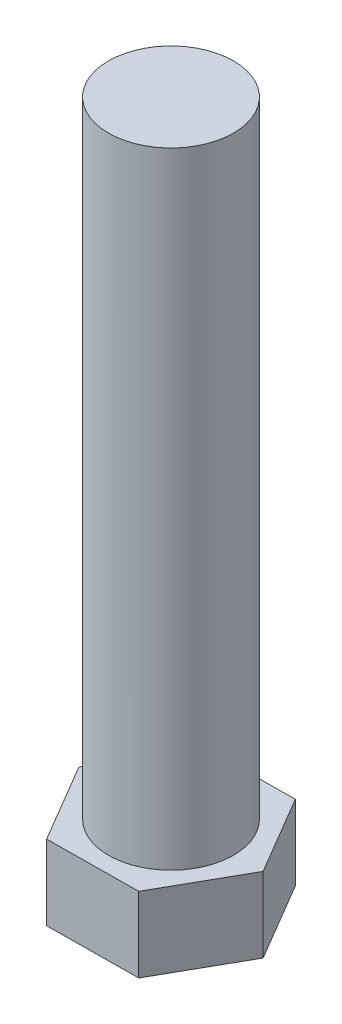
ISO-10303-21;
HEADER;
FILE_DESCRIPTION(('STEP AP214'),'2;1');
FILE_NAME('part.step','',(''),(''),'','','');
FILE_SCHEMA(('AUTOMOTIVE_DESIGN { 1 0 10303 214 1 1 1 1 }'));
ENDSEC;
DATA;
#1=APPLICATION_CONTEXT('core data for automotive mechanical design processes');
#2=APPLICATION_PROTOCOL_DEFINITION('international standard','automotive_design',2000,#1);
#3=PRODUCT_CONTEXT('',#1,'mechanical');
#4=PRODUCT('Part','Part','',(#3));
#5=PRODUCT_RELATED_PRODUCT_CATEGORY('part','',(#4));
#6=PRODUCT_DEFINITION_FORMATION('','',#4);
#7=PRODUCT_DEFINITION_CONTEXT('part definition',#1,'design');
#8=PRODUCT_DEFINITION('design','',#6,#7);
#9=PRODUCT_DEFINITION_SHAPE('','',#8);
#10=(LENGTH_UNIT() NAMED_UNIT(*) SI_UNIT(.MILLI.,.METRE.));
#11=(NAMED_UNIT(*) PLANE_ANGLE_UNIT() SI_UNIT($,.RADIAN.));
#12=(NAMED_UNIT(*) SI_UNIT($,.STERADIAN.) SOLID_ANGLE_UNIT());
#13=UNCERTAINTY_MEASURE_WITH_UNIT(LENGTH_MEASURE(1.E-05),#10,'distance_accuracy_value','');
#14=(GEOMETRIC_REPRESENTATION_CONTEXT(3) GLOBAL_UNCERTAINTY_ASSIGNED_CONTEXT((#13)) GLOBAL_UNIT_ASSIGNED_CONTEXT((#10,
#11,#12)) REPRESENTATION_CONTEXT('',''));
#15=CARTESIAN_POINT('',(0.,0.,0.));
#16=DIRECTION('',(0.,0.,1.));
#17=DIRECTION('',(1.,0.,0.));
#18=AXIS2_PLACEMENT_3D('',#15,#16,#17);
#19=CARTESIAN_POINT('',(0.,50.,0.));
#20=DIRECTION('',(0.,-1.,0.));
#21=DIRECTION('',(0.,0.,-1.));
#22=AXIS2_PLACEMENT_3D('',#19,#20,#21);
#23=CYLINDRICAL_SURFACE('',#22,5.);
#24=CARTESIAN_POINT('',(0.,50.,0.));
#25=DIRECTION('',(0.,1.,0.));
#26=DIRECTION('',(0.,0.,1.));
#27=AXIS2_PLACEMENT_3D('',#24,#25,#26);
#28=CIRCLE('',#27,5.);
#29=CARTESIAN_POINT('',(0.,50.,5.));
#30=VERTEX_POINT('',#29);
#31=EDGE_CURVE('E11',#30,#30,#28,.T.);
#32=ORIENTED_EDGE('',*,*,#31,.F.);
#33=EDGE_LOOP('',(#32));
#34=FACE_BOUND('',#33,.T.);
#35=CARTESIAN_POINT('',(0.,0.,0.));
#36=DIRECTION('',(0.,-1.,0.));
#37=DIRECTION('',(0.,0.,-1.));
#38=AXIS2_PLACEMENT_3D('',#35,#36,#37);
#39=CIRCLE('',#38,5.);
#40=CARTESIAN_POINT('',(0.,0.,-5.));
#41=VERTEX_POINT('',#40);
#42=EDGE_CURVE('E40',#41,#41,#39,.T.);
#43=ORIENTED_EDGE('',*,*,#42,.F.);
#44=EDGE_LOOP('',(#43));
#45=FACE_BOUND('',#44,.T.);
#46=ADVANCED_FACE('F32',(#34,#45),#23,.T.);
#47=CARTESIAN_POINT('',(0.,50.,0.));
#48=DIRECTION('',(0.,1.,0.));
#49=DIRECTION('',(0.,0.,1.));
#50=AXIS2_PLACEMENT_3D('',#47,#48,#49);
#51=PLANE('',#50);
#52=ORIENTED_EDGE('',*,*,#31,.T.);
#53=EDGE_LOOP('',(#52));
#54=FACE_BOUND('',#53,.T.);
#55=ADVANCED_FACE('F142',(#54),#51,.T.);
#56=CARTESIAN_POINT('',(7.29612582719991,-6.,-0.0671599350882289));
#57=DIRECTION('',(-0.87059096019763,0.,-0.492007499965364));
#58=DIRECTION('',(-0.492007499965364,0.,0.87059096019763));
#59=AXIS2_PLACEMENT_3D('',#56,#57,#58);
#60=PLANE('',#59);
#61=DIRECTION('',(-0.492007499965364,0.,0.87059096019763));
#62=VECTOR('',#61,1.);
#63=CARTESIAN_POINT('',(7.29612582719991,0.,-0.0671599350882289));
#64=LINE('',#63,#62);
#65=CARTESIAN_POINT('',(7.29612582719991,0.,-0.0671599350882289));
#66=VERTEX_POINT('',#65);
#67=CARTESIAN_POINT('',(3.70622512350288,0.,6.28505034801876));
#68=VERTEX_POINT('',#67);
#69=EDGE_CURVE('E117',#66,#68,#64,.T.);
#70=ORIENTED_EDGE('',*,*,#69,.T.);
#71=DIRECTION('',(0.,1.,0.));
#72=VECTOR('',#71,1.);
#73=CARTESIAN_POINT('',(3.70622512350288,-6.,6.28505034801876));
#74=LINE('',#73,#72);
#75=CARTESIAN_POINT('',(3.70622512350288,-6.,6.28505034801876));
#76=VERTEX_POINT('',#75);
#77=EDGE_CURVE('E134',#76,#68,#74,.T.);
#78=ORIENTED_EDGE('',*,*,#77,.F.);
#79=DIRECTION('',(-0.492007499965364,0.,0.87059096019763));
#80=VECTOR('',#79,1.);
#81=CARTESIAN_POINT('',(7.29612582719991,-6.,-0.0671599350882289));
#82=LINE('',#81,#80);
#83=CARTESIAN_POINT('',(7.29612582719991,-6.,-0.0671599350882289));
#84=VERTEX_POINT('',#83);
#85=EDGE_CURVE('E127',#84,#76,#82,.T.);
#86=ORIENTED_EDGE('',*,*,#85,.F.);
#87=DIRECTION('',(0.,1.,0.));
#88=VECTOR('',#87,1.);
#89=CARTESIAN_POINT('',(7.29612582719991,-6.,-0.0671599350882289));
#90=LINE('',#89,#88);
#91=EDGE_CURVE('E113',#84,#66,#90,.T.);
#92=ORIENTED_EDGE('',*,*,#91,.T.);
#93=EDGE_LOOP('',(#70,#78,#86,#92));
#94=FACE_BOUND('',#93,.T.);
#95=ADVANCED_FACE('F147',(#94),#60,.F.);
#96=CARTESIAN_POINT('',(3.70622512350288,-6.,6.28505034801876));
#97=DIRECTION('',(-0.00920448627633804,0.,-0.999957637818917));
#98=DIRECTION('',(-0.999957637818917,0.,0.00920448627633804));
#99=AXIS2_PLACEMENT_3D('',#96,#97,#98);
#100=PLANE('',#99);
#101=DIRECTION('',(-0.999957637818917,0.,0.00920448627633804));
#102=VECTOR('',#101,1.);
#103=CARTESIAN_POINT('',(3.70622512350288,0.,6.28505034801876));
#104=LINE('',#103,#102);
#105=CARTESIAN_POINT('',(-3.58990070369704,0.,6.35221028310699));
#106=VERTEX_POINT('',#105);
#107=EDGE_CURVE('E120',#68,#106,#104,.T.);
#108=ORIENTED_EDGE('',*,*,#107,.T.);
#109=DIRECTION('',(0.,1.,0.));
#110=VECTOR('',#109,1.);
#111=CARTESIAN_POINT('',(-3.58990070369704,-6.,6.35221028310699));
#112=LINE('',#111,#110);
#113=CARTESIAN_POINT('',(-3.58990070369704,-6.,6.35221028310699));
#114=VERTEX_POINT('',#113);
#115=EDGE_CURVE('E131',#114,#106,#112,.T.);
#116=ORIENTED_EDGE('',*,*,#115,.F.);
#117=DIRECTION('',(-0.999957637818917,0.,0.00920448627633804));
#118=VECTOR('',#117,1.);
#119=CARTESIAN_POINT('',(3.70622512350288,-6.,6.28505034801876));
#120=LINE('',#119,#118);
#121=EDGE_CURVE('E86',#76,#114,#120,.T.);
#122=ORIENTED_EDGE('',*,*,#121,.F.);
#123=ORIENTED_EDGE('',*,*,#77,.T.);
#124=EDGE_LOOP('',(#108,#116,#122,#123));
#125=FACE_BOUND('',#124,.T.);
#126=ADVANCED_FACE('F153',(#125),#100,.F.);
#127=CARTESIAN_POINT('',(-3.58990070369704,-6.,6.35221028310699));
#128=DIRECTION('',(0.861386473921292,0.,-0.507950137853552));
#129=DIRECTION('',(-0.507950137853552,0.,-0.861386473921292));
#130=AXIS2_PLACEMENT_3D('',#127,#128,#129);
#131=PLANE('',#130);
#132=DIRECTION('',(-0.507950137853552,0.,-0.861386473921292));
#133=VECTOR('',#132,1.);
#134=CARTESIAN_POINT('',(-3.58990070369704,0.,6.35221028310699));
#135=LINE('',#134,#133);
#136=CARTESIAN_POINT('',(-7.29612582719991,0.,0.0671599350882271));
#137=VERTEX_POINT('',#136);
#138=EDGE_CURVE('E122',#106,#137,#135,.T.);
#139=ORIENTED_EDGE('',*,*,#138,.T.);
#140=DIRECTION('',(0.,1.,0.));
#141=VECTOR('',#140,1.);
#142=CARTESIAN_POINT('',(-7.29612582719991,-6.,0.0671599350882271));
#143=LINE('',#142,#141);
#144=CARTESIAN_POINT('',(-7.29612582719991,-6.,0.0671599350882271));
#145=VERTEX_POINT('',#144);
#146=EDGE_CURVE('E108',#145,#137,#143,.T.);
#147=ORIENTED_EDGE('',*,*,#146,.F.);
#148=DIRECTION('',(-0.507950137853552,0.,-0.861386473921292));
#149=VECTOR('',#148,1.);
#150=CARTESIAN_POINT('',(-3.58990070369704,-6.,6.35221028310699));
#151=LINE('',#150,#149);
#152=EDGE_CURVE('E99',#114,#145,#151,.T.);
#153=ORIENTED_EDGE('',*,*,#152,.F.);
#154=ORIENTED_EDGE('',*,*,#115,.T.);
#155=EDGE_LOOP('',(#139,#147,#153,#154));
#156=FACE_BOUND('',#155,.T.);
#157=ADVANCED_FACE('F159',(#156),#131,.F.);
#158=CARTESIAN_POINT('',(-7.29612582719991,-6.,0.0671599350882271));
#159=DIRECTION('',(0.87059096019763,0.,0.492007499965365));
#160=DIRECTION('',(0.492007499965365,0.,-0.87059096019763));
#161=AXIS2_PLACEMENT_3D('',#158,#159,#160);
#162=PLANE('',#161);
#163=DIRECTION('',(0.492007499965365,0.,-0.87059096019763));
#164=VECTOR('',#163,1.);
#165=CARTESIAN_POINT('',(-7.29612582719991,0.,0.0671599350882271));
#166=LINE('',#165,#164);
#167=CARTESIAN_POINT('',(-3.70622512350287,0.,-6.28505034801877));
#168=VERTEX_POINT('',#167);
#169=EDGE_CURVE('E107',#137,#168,#166,.T.);
#170=ORIENTED_EDGE('',*,*,#169,.T.);
#171=DIRECTION('',(0.,1.,0.));
#172=VECTOR('',#171,1.);
#173=CARTESIAN_POINT('',(-3.70622512350287,-6.,-6.28505034801877));
#174=LINE('',#173,#172);
#175=CARTESIAN_POINT('',(-3.70622512350287,-6.,-6.28505034801877));
#176=VERTEX_POINT('',#175);
#177=EDGE_CURVE('E104',#176,#168,#174,.T.);
#178=ORIENTED_EDGE('',*,*,#177,.F.);
#179=DIRECTION('',(0.492007499965365,0.,-0.87059096019763));
#180=VECTOR('',#179,1.);
#181=CARTESIAN_POINT('',(-7.29612582719991,-6.,0.0671599350882271));
#182=LINE('',#181,#180);
#183=EDGE_CURVE('E93',#145,#176,#182,.T.);
#184=ORIENTED_EDGE('',*,*,#183,.F.);
#185=ORIENTED_EDGE('',*,*,#146,.T.);
#186=EDGE_LOOP('',(#170,#178,#184,#185));
#187=FACE_BOUND('',#186,.T.);
#188=ADVANCED_FACE('F105',(#187),#162,.F.);
#189=CARTESIAN_POINT('',(-3.70622512350287,-6.,-6.28505034801877));
#190=DIRECTION('',(0.00920448627633804,0.,0.999957637818917));
#191=DIRECTION('',(0.999957637818917,0.,-0.00920448627633804));
#192=AXIS2_PLACEMENT_3D('',#189,#190,#191);
#193=PLANE('',#192);
#194=DIRECTION('',(0.999957637818917,0.,-0.00920448627633804));
#195=VECTOR('',#194,1.);
#196=CARTESIAN_POINT('',(-3.70622512350287,0.,-6.28505034801877));
#197=LINE('',#196,#195);
#198=CARTESIAN_POINT('',(3.58990070369704,0.,-6.352210283107));
#199=VERTEX_POINT('',#198);
#200=EDGE_CURVE('E71',#168,#199,#197,.T.);
#201=ORIENTED_EDGE('',*,*,#200,.T.);
#202=DIRECTION('',(0.,1.,0.));
#203=VECTOR('',#202,1.);
#204=CARTESIAN_POINT('',(3.58990070369704,-6.,-6.352210283107));
#205=LINE('',#204,#203);
#206=CARTESIAN_POINT('',(3.58990070369704,-6.,-6.352210283107));
#207=VERTEX_POINT('',#206);
#208=EDGE_CURVE('E109',#207,#199,#205,.T.);
#209=ORIENTED_EDGE('',*,*,#208,.F.);
#210=DIRECTION('',(0.999957637818917,0.,-0.00920448627633804));
#211=VECTOR('',#210,1.);
#212=CARTESIAN_POINT('',(-3.70622512350287,-6.,-6.28505034801877));
#213=LINE('',#212,#211);
#214=EDGE_CURVE('E97',#176,#207,#213,.T.);
#215=ORIENTED_EDGE('',*,*,#214,.F.);
#216=ORIENTED_EDGE('',*,*,#177,.T.);
#217=EDGE_LOOP('',(#201,#209,#215,#216));
#218=FACE_BOUND('',#217,.T.);
#219=ADVANCED_FACE('F111',(#218),#193,.F.);
#220=CARTESIAN_POINT('',(3.58990070369704,-6.,-6.352210283107));
#221=DIRECTION('',(-0.861386473921292,0.,0.507950137853552));
#222=DIRECTION('',(0.507950137853552,0.,0.861386473921292));
#223=AXIS2_PLACEMENT_3D('',#220,#221,#222);
#224=PLANE('',#223);
#225=DIRECTION('',(0.507950137853552,0.,0.861386473921292));
#226=VECTOR('',#225,1.);
#227=CARTESIAN_POINT('',(3.58990070369704,0.,-6.352210283107));
#228=LINE('',#227,#226);
#229=EDGE_CURVE('E77',#199,#66,#228,.T.);
#230=ORIENTED_EDGE('',*,*,#229,.T.);
#231=ORIENTED_EDGE('',*,*,#91,.F.);
#232=DIRECTION('',(0.507950137853552,0.,0.861386473921292));
#233=VECTOR('',#232,1.);
#234=CARTESIAN_POINT('',(3.58990070369704,-6.,-6.352210283107));
#235=LINE('',#234,#233);
#236=EDGE_CURVE('E48',#207,#84,#235,.T.);
#237=ORIENTED_EDGE('',*,*,#236,.F.);
#238=ORIENTED_EDGE('',*,*,#208,.T.);
#239=EDGE_LOOP('',(#230,#231,#237,#238));
#240=FACE_BOUND('',#239,.T.);
#241=ADVANCED_FACE('F167',(#240),#224,.F.);
#242=CARTESIAN_POINT('',(0.,-6.,0.));
#243=DIRECTION('',(0.,-1.,0.));
#244=DIRECTION('',(0.,0.,-1.));
#245=AXIS2_PLACEMENT_3D('',#242,#243,#244);
#246=PLANE('',#245);
#247=ORIENTED_EDGE('',*,*,#85,.T.);
#248=ORIENTED_EDGE('',*,*,#121,.T.);
#249=ORIENTED_EDGE('',*,*,#152,.T.);
#250=ORIENTED_EDGE('',*,*,#183,.T.);
#251=ORIENTED_EDGE('',*,*,#214,.T.);
#252=ORIENTED_EDGE('',*,*,#236,.T.);
#253=EDGE_LOOP('',(#247,#248,#249,#250,#251,#252));
#254=FACE_BOUND('',#253,.T.);
#255=ADVANCED_FACE('F95',(#254),#246,.T.);
#256=CARTESIAN_POINT('',(0.,0.,0.));
#257=DIRECTION('',(0.,-1.,0.));
#258=DIRECTION('',(0.,0.,-1.));
#259=AXIS2_PLACEMENT_3D('',#256,#257,#258);
#260=PLANE('',#259);
#261=ORIENTED_EDGE('',*,*,#42,.T.);
#262=EDGE_LOOP('',(#261));
#263=FACE_BOUND('',#262,.T.);
#264=ORIENTED_EDGE('',*,*,#69,.F.);
#265=ORIENTED_EDGE('',*,*,#229,.F.);
#266=ORIENTED_EDGE('',*,*,#200,.F.);
#267=ORIENTED_EDGE('',*,*,#169,.F.);
#268=ORIENTED_EDGE('',*,*,#138,.F.);
#269=ORIENTED_EDGE('',*,*,#107,.F.);
#270=EDGE_LOOP('',(#264,#265,#266,#267,#268,#269));
#271=FACE_BOUND('',#270,.T.);
#272=ADVANCED_FACE('F138',(#263,#271),#260,.F.);
#273=CLOSED_SHELL('',(#46,#55,#95,#126,#157,#188,#219,#241,#255,#272));
#274=MANIFOLD_SOLID_BREP('B2',#273);
#275=ADVANCED_BREP_SHAPE_REPRESENTATION('',(#18,#274),#14);
#276=SHAPE_DEFINITION_REPRESENTATION(#9,#275);
ENDSEC;
END-ISO-10303-21;
